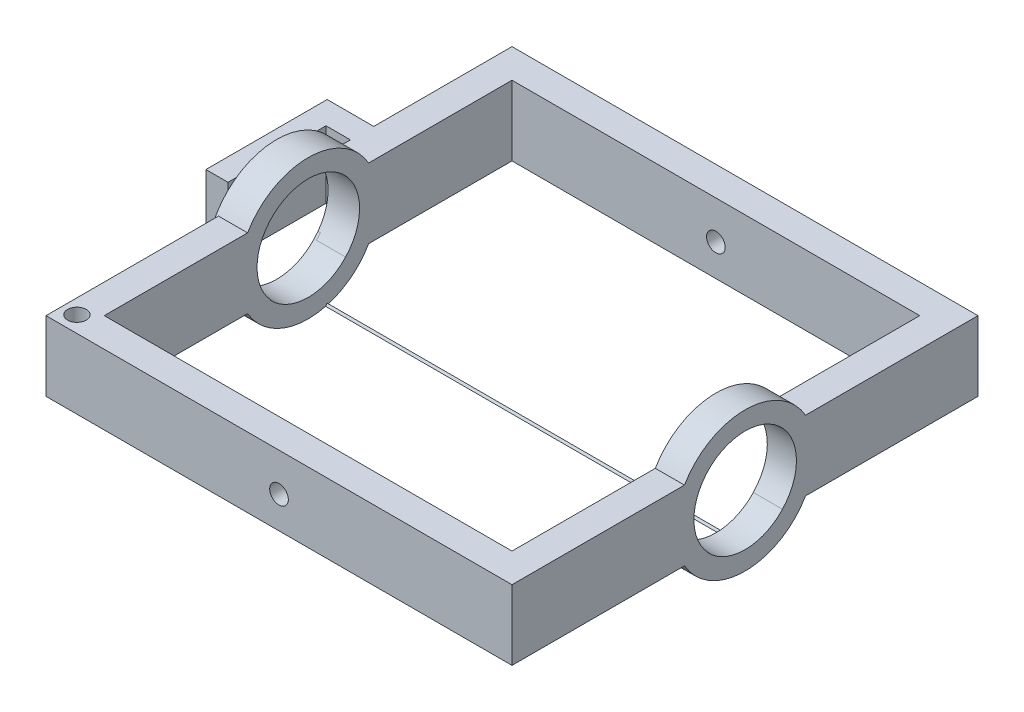
ISO-10303-21;
HEADER;
FILE_DESCRIPTION(('STEP AP214'),'2;1');
FILE_NAME('part.step','',(''),(''),'','','');
FILE_SCHEMA(('AUTOMOTIVE_DESIGN { 1 0 10303 214 1 1 1 1 }'));
ENDSEC;
DATA;
#1=APPLICATION_CONTEXT('core data for automotive mechanical design processes');
#2=APPLICATION_PROTOCOL_DEFINITION('international standard','automotive_design',2000,#1);
#3=PRODUCT_CONTEXT('',#1,'mechanical');
#4=PRODUCT('Part','Part','',(#3));
#5=PRODUCT_RELATED_PRODUCT_CATEGORY('part','',(#4));
#6=PRODUCT_DEFINITION_FORMATION('','',#4);
#7=PRODUCT_DEFINITION_CONTEXT('part definition',#1,'design');
#8=PRODUCT_DEFINITION('design','',#6,#7);
#9=PRODUCT_DEFINITION_SHAPE('','',#8);
#10=(LENGTH_UNIT() NAMED_UNIT(*) SI_UNIT(.MILLI.,.METRE.));
#11=(NAMED_UNIT(*) PLANE_ANGLE_UNIT() SI_UNIT($,.RADIAN.));
#12=(NAMED_UNIT(*) SI_UNIT($,.STERADIAN.) SOLID_ANGLE_UNIT());
#13=UNCERTAINTY_MEASURE_WITH_UNIT(LENGTH_MEASURE(1.E-05),#10,'distance_accuracy_value','');
#14=(GEOMETRIC_REPRESENTATION_CONTEXT(3) GLOBAL_UNCERTAINTY_ASSIGNED_CONTEXT((#13)) GLOBAL_UNIT_ASSIGNED_CONTEXT((#10,
#11,#12)) REPRESENTATION_CONTEXT('',''));
#15=CARTESIAN_POINT('',(0.,0.,0.));
#16=DIRECTION('',(0.,0.,1.));
#17=DIRECTION('',(1.,0.,0.));
#18=AXIS2_PLACEMENT_3D('',#15,#16,#17);
#19=CARTESIAN_POINT('',(-101.,15.,0.));
#20=DIRECTION('',(1.,0.,0.));
#21=DIRECTION('',(0.,0.,-1.));
#22=AXIS2_PLACEMENT_3D('',#19,#20,#21);
#23=CYLINDRICAL_SURFACE('',#22,30.);
#24=DIRECTION('',(1.,0.,0.));
#25=VECTOR('',#24,1.);
#26=CARTESIAN_POINT('',(-101.,30.,-25.9807621135332));
#27=LINE('',#26,#25);
#28=CARTESIAN_POINT('',(100.,30.,-25.9807621135332));
#29=VERTEX_POINT('',#28);
#30=CARTESIAN_POINT('',(87.5000000000002,30.,-25.9807621135332));
#31=VERTEX_POINT('',#30);
#32=EDGE_CURVE('E417',#29,#31,#27,.F.);
#33=ORIENTED_EDGE('',*,*,#32,.T.);
#34=CARTESIAN_POINT('',(87.5000000000002,15.,0.));
#35=DIRECTION('',(1.,0.,0.));
#36=DIRECTION('',(0.,0.,-1.));
#37=AXIS2_PLACEMENT_3D('',#34,#35,#36);
#38=CIRCLE('',#37,30.);
#39=CARTESIAN_POINT('',(87.5000000000002,30.,25.9807621135332));
#40=VERTEX_POINT('',#39);
#41=EDGE_CURVE('E295',#40,#31,#38,.F.);
#42=ORIENTED_EDGE('',*,*,#41,.F.);
#43=DIRECTION('',(1.,0.,0.));
#44=VECTOR('',#43,1.);
#45=CARTESIAN_POINT('',(-101.,30.,25.9807621135332));
#46=LINE('',#45,#44);
#47=CARTESIAN_POINT('',(100.,30.,25.9807621135331));
#48=VERTEX_POINT('',#47);
#49=EDGE_CURVE('E406',#40,#48,#46,.T.);
#50=ORIENTED_EDGE('',*,*,#49,.T.);
#51=CARTESIAN_POINT('',(100.,15.,0.));
#52=DIRECTION('',(1.,0.,0.));
#53=DIRECTION('',(0.,0.,-1.));
#54=AXIS2_PLACEMENT_3D('',#51,#52,#53);
#55=CIRCLE('',#54,30.);
#56=EDGE_CURVE('E382',#29,#48,#55,.T.);
#57=ORIENTED_EDGE('',*,*,#56,.F.);
#58=EDGE_LOOP('',(#33,#42,#50,#57));
#59=FACE_BOUND('',#58,.T.);
#60=ADVANCED_FACE('F35',(#59),#23,.T.);
#61=CARTESIAN_POINT('',(-101.,15.,0.));
#62=DIRECTION('',(1.,0.,0.));
#63=DIRECTION('',(0.,0.,-1.));
#64=AXIS2_PLACEMENT_3D('',#61,#62,#63);
#65=CYLINDRICAL_SURFACE('',#64,22.);
#66=CARTESIAN_POINT('',(-87.5,15.,0.));
#67=DIRECTION('',(1.,0.,0.));
#68=DIRECTION('',(0.,0.,-1.));
#69=AXIS2_PLACEMENT_3D('',#66,#67,#68);
#70=CIRCLE('',#69,22.);
#71=CARTESIAN_POINT('',(-87.5,0.,-16.0934769394311));
#72=VERTEX_POINT('',#71);
#73=CARTESIAN_POINT('',(-87.5,0.,16.0934769394311));
#74=VERTEX_POINT('',#73);
#75=EDGE_CURVE('E285',#72,#74,#70,.F.);
#76=ORIENTED_EDGE('',*,*,#75,.F.);
#77=DIRECTION('',(1.,0.,0.));
#78=VECTOR('',#77,1.);
#79=CARTESIAN_POINT('',(-101.,0.,-16.0934769394311));
#80=LINE('',#79,#78);
#81=CARTESIAN_POINT('',(-100.,0.,-16.0934769394311));
#82=VERTEX_POINT('',#81);
#83=EDGE_CURVE('E391',#72,#82,#80,.F.);
#84=ORIENTED_EDGE('',*,*,#83,.T.);
#85=CARTESIAN_POINT('',(-100.,15.,0.));
#86=DIRECTION('',(1.,0.,0.));
#87=DIRECTION('',(0.,0.,-1.));
#88=AXIS2_PLACEMENT_3D('',#85,#86,#87);
#89=CIRCLE('',#88,22.);
#90=CARTESIAN_POINT('',(-100.,1.98598373428147,-17.7379643881595));
#91=VERTEX_POINT('',#90);
#92=EDGE_CURVE('E394',#82,#91,#89,.T.);
#93=ORIENTED_EDGE('',*,*,#92,.T.);
#94=DIRECTION('',(1.,0.,0.));
#95=VECTOR('',#94,1.);
#96=CARTESIAN_POINT('',(-0.500000000000028,1.98598373428147,-17.7379643881595));
#97=LINE('',#96,#95);
#98=CARTESIAN_POINT('',(-101.,1.98598373428147,-17.7379643881595));
#99=VERTEX_POINT('',#98);
#100=EDGE_CURVE('E353',#91,#99,#97,.F.);
#101=ORIENTED_EDGE('',*,*,#100,.T.);
#102=CARTESIAN_POINT('',(-101.,15.,0.));
#103=DIRECTION('',(1.,0.,0.));
#104=DIRECTION('',(0.,0.,-1.));
#105=AXIS2_PLACEMENT_3D('',#102,#103,#104);
#106=CIRCLE('',#105,22.);
#107=CARTESIAN_POINT('',(-101.,28.1147890774808,17.6635870494413));
#108=VERTEX_POINT('',#107);
#109=EDGE_CURVE('E372',#108,#99,#106,.T.);
#110=ORIENTED_EDGE('',*,*,#109,.F.);
#111=DIRECTION('',(1.,0.,0.));
#112=VECTOR('',#111,1.);
#113=CARTESIAN_POINT('',(-0.500000000000028,28.1147890774808,17.6635870494413));
#114=LINE('',#113,#112);
#115=CARTESIAN_POINT('',(-100.,28.1147890774808,17.6635870494413));
#116=VERTEX_POINT('',#115);
#117=EDGE_CURVE('E363',#108,#116,#114,.T.);
#118=ORIENTED_EDGE('',*,*,#117,.T.);
#119=CARTESIAN_POINT('',(-100.,15.,0.));
#120=DIRECTION('',(1.,0.,0.));
#121=DIRECTION('',(0.,0.,-1.));
#122=AXIS2_PLACEMENT_3D('',#119,#120,#121);
#123=CIRCLE('',#122,22.);
#124=CARTESIAN_POINT('',(-100.,0.,16.0934769394311));
#125=VERTEX_POINT('',#124);
#126=EDGE_CURVE('E387',#116,#125,#123,.T.);
#127=ORIENTED_EDGE('',*,*,#126,.T.);
#128=DIRECTION('',(1.,0.,0.));
#129=VECTOR('',#128,1.);
#130=CARTESIAN_POINT('',(-101.,0.,16.0934769394311));
#131=LINE('',#130,#129);
#132=EDGE_CURVE('E381',#125,#74,#131,.T.);
#133=ORIENTED_EDGE('',*,*,#132,.T.);
#134=EDGE_LOOP('',(#76,#84,#93,#101,#110,#118,#127,#133));
#135=FACE_BOUND('',#134,.T.);
#136=ADVANCED_FACE('F649',(#135),#65,.F.);
#137=CARTESIAN_POINT('',(-101.,15.1007728117623,-0.0743773387182023));
#138=DIRECTION('',(1.,0.,0.));
#139=DIRECTION('',(0.,0.,-1.));
#140=AXIS2_PLACEMENT_3D('',#137,#138,#139);
#141=CYLINDRICAL_SURFACE('',#140,22.);
#142=DIRECTION('',(1.,0.,0.));
#143=VECTOR('',#142,1.);
#144=CARTESIAN_POINT('',(-101.,0.,-16.0733354450306));
#145=LINE('',#144,#143);
#146=CARTESIAN_POINT('',(-87.5,0.,-16.0733354450306));
#147=VERTEX_POINT('',#146);
#148=CARTESIAN_POINT('',(-100.,0.,-16.0733354450306));
#149=VERTEX_POINT('',#148);
#150=EDGE_CURVE('E348',#147,#149,#145,.F.);
#151=ORIENTED_EDGE('',*,*,#150,.F.);
#152=CARTESIAN_POINT('',(-87.5,15.1007728117623,-0.0743773387182023));
#153=DIRECTION('',(-1.,0.,0.));
#154=DIRECTION('',(0.,0.,1.));
#155=AXIS2_PLACEMENT_3D('',#152,#153,#154);
#156=CIRCLE('',#155,22.);
#157=CARTESIAN_POINT('',(-87.5,0.,15.9245807675942));
#158=VERTEX_POINT('',#157);
#159=EDGE_CURVE('E352',#158,#147,#156,.T.);
#160=ORIENTED_EDGE('',*,*,#159,.F.);
#161=DIRECTION('',(1.,0.,0.));
#162=VECTOR('',#161,1.);
#163=CARTESIAN_POINT('',(-101.,0.,15.9245807675942));
#164=LINE('',#163,#162);
#165=CARTESIAN_POINT('',(-100.,0.,15.9245807675942));
#166=VERTEX_POINT('',#165);
#167=EDGE_CURVE('E358',#166,#158,#164,.T.);
#168=ORIENTED_EDGE('',*,*,#167,.F.);
#169=CARTESIAN_POINT('',(-100.,15.1007728117623,-0.0743773387182023));
#170=DIRECTION('',(1.,0.,0.));
#171=DIRECTION('',(0.,0.,-1.));
#172=AXIS2_PLACEMENT_3D('',#169,#170,#171);
#173=CIRCLE('',#172,22.);
#174=EDGE_CURVE('E367',#116,#166,#173,.T.);
#175=ORIENTED_EDGE('',*,*,#174,.F.);
#176=ORIENTED_EDGE('',*,*,#117,.F.);
#177=CARTESIAN_POINT('',(-101.,15.1007728117623,-0.0743773387182023));
#178=DIRECTION('',(1.,0.,0.));
#179=DIRECTION('',(0.,0.,-1.));
#180=AXIS2_PLACEMENT_3D('',#177,#178,#179);
#181=CIRCLE('',#180,22.);
#182=EDGE_CURVE('E345',#99,#108,#181,.T.);
#183=ORIENTED_EDGE('',*,*,#182,.F.);
#184=ORIENTED_EDGE('',*,*,#100,.F.);
#185=CARTESIAN_POINT('',(-100.,15.1007728117623,-0.0743773387182023));
#186=DIRECTION('',(1.,0.,0.));
#187=DIRECTION('',(0.,0.,-1.));
#188=AXIS2_PLACEMENT_3D('',#185,#186,#187);
#189=CIRCLE('',#188,22.);
#190=EDGE_CURVE('E356',#149,#91,#189,.T.);
#191=ORIENTED_EDGE('',*,*,#190,.F.);
#192=EDGE_LOOP('',(#151,#160,#168,#175,#176,#183,#184,#191));
#193=FACE_BOUND('',#192,.T.);
#194=ADVANCED_FACE('F658',(#193),#141,.F.);
#195=CARTESIAN_POINT('',(87.5000000000002,15.3761332783802,31.9163524114279));
#196=DIRECTION('',(-1.,0.,0.));
#197=DIRECTION('',(0.,0.,1.));
#198=AXIS2_PLACEMENT_3D('',#195,#196,#197);
#199=CYLINDRICAL_SURFACE('',#198,49.1927831016251);
#200=CARTESIAN_POINT('',(87.5000000000002,15.3761332783802,31.9163524114279));
#201=DIRECTION('',(1.,0.,0.));
#202=DIRECTION('',(0.,0.,-1.));
#203=AXIS2_PLACEMENT_3D('',#200,#201,#202);
#204=CIRCLE('',#203,49.1927831016251);
#205=CARTESIAN_POINT('',(87.5000000000002,-14.0451900440909,-7.50845758479339));
#206=VERTEX_POINT('',#205);
#207=CARTESIAN_POINT('',(87.5000000000002,-13.164393734876,-8.15069423652366));
#208=VERTEX_POINT('',#207);
#209=EDGE_CURVE('E279',#206,#208,#204,.T.);
#210=ORIENTED_EDGE('',*,*,#209,.T.);
#211=DIRECTION('',(-1.,0.,0.));
#212=VECTOR('',#211,1.);
#213=CARTESIAN_POINT('',(0.,-13.164393734876,-8.15069423652365));
#214=LINE('',#213,#212);
#215=CARTESIAN_POINT('',(-87.5,-13.164393734876,-8.15069423652366));
#216=VERTEX_POINT('',#215);
#217=EDGE_CURVE('E11',#208,#216,#214,.T.);
#218=ORIENTED_EDGE('',*,*,#217,.T.);
#219=CARTESIAN_POINT('',(-87.5,15.3761332783802,31.9163524114279));
#220=DIRECTION('',(1.,0.,0.));
#221=DIRECTION('',(0.,0.,-1.));
#222=AXIS2_PLACEMENT_3D('',#219,#220,#221);
#223=CIRCLE('',#222,49.1927831016251);
#224=CARTESIAN_POINT('',(-87.5,-14.0451900440909,-7.50845758479339));
#225=VERTEX_POINT('',#224);
#226=EDGE_CURVE('E276',#225,#216,#223,.T.);
#227=ORIENTED_EDGE('',*,*,#226,.F.);
#228=DIRECTION('',(-1.,0.,0.));
#229=VECTOR('',#228,1.);
#230=CARTESIAN_POINT('',(0.,-14.0451900440909,-7.50845758479339));
#231=LINE('',#230,#229);
#232=EDGE_CURVE('E299',#206,#225,#231,.T.);
#233=ORIENTED_EDGE('',*,*,#232,.F.);
#234=EDGE_LOOP('',(#210,#218,#227,#233));
#235=FACE_BOUND('',#234,.T.);
#236=ADVANCED_FACE('F275',(#235),#199,.F.);
#237=CARTESIAN_POINT('',(-100.,30.,-100.));
#238=DIRECTION('',(1.,0.,0.));
#239=DIRECTION('',(0.,0.,-1.));
#240=AXIS2_PLACEMENT_3D('',#237,#238,#239);
#241=PLANE('',#240);
#242=DIRECTION('',(0.,-1.,0.));
#243=VECTOR('',#242,1.);
#244=CARTESIAN_POINT('',(-100.,30.,-40.6668274564764));
#245=LINE('',#244,#243);
#246=CARTESIAN_POINT('',(-100.,30.,-40.6668274564764));
#247=VERTEX_POINT('',#246);
#248=CARTESIAN_POINT('',(-100.,1.14409561425077,-40.6668274564764));
#249=VERTEX_POINT('',#248);
#250=EDGE_CURVE('E342',#247,#249,#245,.T.);
#251=ORIENTED_EDGE('',*,*,#250,.F.);
#252=DIRECTION('',(0.,0.,1.));
#253=VECTOR('',#252,1.);
#254=CARTESIAN_POINT('',(-100.,30.,-100.));
#255=LINE('',#254,#253);
#256=CARTESIAN_POINT('',(-100.,30.,-100.));
#257=VERTEX_POINT('',#256);
#258=EDGE_CURVE('E478',#257,#247,#255,.T.);
#259=ORIENTED_EDGE('',*,*,#258,.F.);
#260=DIRECTION('',(0.,-1.,0.));
#261=VECTOR('',#260,1.);
#262=CARTESIAN_POINT('',(-100.,30.,-100.));
#263=LINE('',#262,#261);
#264=CARTESIAN_POINT('',(-100.,0.,-100.));
#265=VERTEX_POINT('',#264);
#266=EDGE_CURVE('E504',#257,#265,#263,.T.);
#267=ORIENTED_EDGE('',*,*,#266,.T.);
#268=DIRECTION('',(0.,0.,1.));
#269=VECTOR('',#268,1.);
#270=CARTESIAN_POINT('',(-100.,0.,-100.));
#271=LINE('',#270,#269);
#272=CARTESIAN_POINT('',(-100.,0.,-25.9807621135332));
#273=VERTEX_POINT('',#272);
#274=EDGE_CURVE('E492',#265,#273,#271,.T.);
#275=ORIENTED_EDGE('',*,*,#274,.T.);
#276=CARTESIAN_POINT('',(-100.,15.,0.));
#277=DIRECTION('',(1.,0.,0.));
#278=DIRECTION('',(0.,0.,-1.));
#279=AXIS2_PLACEMENT_3D('',#276,#277,#278);
#280=CIRCLE('',#279,30.);
#281=CARTESIAN_POINT('',(-100.,30.,-25.9807621135332));
#282=VERTEX_POINT('',#281);
#283=EDGE_CURVE('E416',#273,#282,#280,.T.);
#284=ORIENTED_EDGE('',*,*,#283,.T.);
#285=CARTESIAN_POINT('',(-100.,30.,-30.6579049439222));
#286=VERTEX_POINT('',#285);
#287=EDGE_CURVE('E56',#286,#282,#255,.T.);
#288=ORIENTED_EDGE('',*,*,#287,.F.);
#289=DIRECTION('',(0.,1.,0.));
#290=VECTOR('',#289,1.);
#291=CARTESIAN_POINT('',(-100.,30.,-30.6579049439222));
#292=LINE('',#291,#290);
#293=CARTESIAN_POINT('',(-100.,1.14409561425077,-30.6579049439222));
#294=VERTEX_POINT('',#293);
#295=EDGE_CURVE('E340',#294,#286,#292,.T.);
#296=ORIENTED_EDGE('',*,*,#295,.F.);
#297=DIRECTION('',(0.,0.,1.));
#298=VECTOR('',#297,1.);
#299=CARTESIAN_POINT('',(-100.,1.14409561425077,-100.));
#300=LINE('',#299,#298);
#301=EDGE_CURVE('E50',#249,#294,#300,.T.);
#302=ORIENTED_EDGE('',*,*,#301,.F.);
#303=EDGE_LOOP('',(#251,#259,#267,#275,#284,#288,#296,#302));
#304=FACE_BOUND('',#303,.T.);
#305=ADVANCED_FACE('F543',(#304),#241,.F.);
#306=CARTESIAN_POINT('',(0.,13.6147395955971,-150.5));
#307=DIRECTION('',(0.,0.,1.));
#308=DIRECTION('',(1.,0.,0.));
#309=AXIS2_PLACEMENT_3D('',#306,#307,#308);
#310=CYLINDRICAL_SURFACE('',#309,4.);
#311=CARTESIAN_POINT('',(0.,13.6147395955971,100.));
#312=DIRECTION('',(0.,0.,1.));
#313=DIRECTION('',(1.,0.,0.));
#314=AXIS2_PLACEMENT_3D('',#311,#312,#313);
#315=CIRCLE('',#314,4.);
#316=CARTESIAN_POINT('',(4.,13.6147395955971,100.));
#317=VERTEX_POINT('',#316);
#318=EDGE_CURVE('E419',#317,#317,#315,.T.);
#319=ORIENTED_EDGE('',*,*,#318,.T.);
#320=EDGE_LOOP('',(#319));
#321=FACE_BOUND('',#320,.T.);
#322=CARTESIAN_POINT('',(0.,13.6147395955971,87.5));
#323=DIRECTION('',(0.,0.,1.));
#324=DIRECTION('',(1.,0.,0.));
#325=AXIS2_PLACEMENT_3D('',#322,#323,#324);
#326=CIRCLE('',#325,4.);
#327=CARTESIAN_POINT('',(4.,13.6147395955971,87.5));
#328=VERTEX_POINT('',#327);
#329=EDGE_CURVE('E423',#328,#328,#326,.T.);
#330=ORIENTED_EDGE('',*,*,#329,.F.);
#331=EDGE_LOOP('',(#330));
#332=FACE_BOUND('',#331,.T.);
#333=ADVANCED_FACE('F738',(#321,#332),#310,.F.);
#334=CARTESIAN_POINT('',(0.,13.6147395955971,-87.5));
#335=DIRECTION('',(0.,0.,-1.));
#336=DIRECTION('',(-1.,0.,0.));
#337=AXIS2_PLACEMENT_3D('',#334,#335,#336);
#338=CIRCLE('',#337,4.);
#339=CARTESIAN_POINT('',(-4.,13.6147395955971,-87.5));
#340=VERTEX_POINT('',#339);
#341=EDGE_CURVE('E422',#340,#340,#338,.T.);
#342=ORIENTED_EDGE('',*,*,#341,.F.);
#343=EDGE_LOOP('',(#342));
#344=FACE_BOUND('',#343,.T.);
#345=CARTESIAN_POINT('',(0.,13.6147395955971,-100.));
#346=DIRECTION('',(0.,0.,1.));
#347=DIRECTION('',(1.,0.,0.));
#348=AXIS2_PLACEMENT_3D('',#345,#346,#347);
#349=CIRCLE('',#348,4.);
#350=CARTESIAN_POINT('',(4.,13.6147395955971,-100.));
#351=VERTEX_POINT('',#350);
#352=EDGE_CURVE('E426',#351,#351,#349,.T.);
#353=ORIENTED_EDGE('',*,*,#352,.F.);
#354=EDGE_LOOP('',(#353));
#355=FACE_BOUND('',#354,.T.);
#356=ADVANCED_FACE('F936',(#344,#355),#310,.F.);
#357=CARTESIAN_POINT('',(-87.5,0.,-87.5));
#358=DIRECTION('',(0.,0.,-1.));
#359=DIRECTION('',(-1.,0.,0.));
#360=AXIS2_PLACEMENT_3D('',#357,#358,#359);
#361=PLANE('',#360);
#362=ORIENTED_EDGE('',*,*,#341,.T.);
#363=EDGE_LOOP('',(#362));
#364=FACE_BOUND('',#363,.T.);
#365=DIRECTION('',(-1.,0.,0.));
#366=VECTOR('',#365,1.);
#367=CARTESIAN_POINT('',(-87.5,30.,-87.5));
#368=LINE('',#367,#366);
#369=CARTESIAN_POINT('',(87.5,30.,-87.5));
#370=VERTEX_POINT('',#369);
#371=CARTESIAN_POINT('',(-87.5,30.,-87.5));
#372=VERTEX_POINT('',#371);
#373=EDGE_CURVE('E451',#370,#372,#368,.T.);
#374=ORIENTED_EDGE('',*,*,#373,.T.);
#375=DIRECTION('',(0.,1.,0.));
#376=VECTOR('',#375,1.);
#377=CARTESIAN_POINT('',(-87.5,0.,-87.5));
#378=LINE('',#377,#376);
#379=CARTESIAN_POINT('',(-87.5,0.,-87.5));
#380=VERTEX_POINT('',#379);
#381=EDGE_CURVE('E468',#380,#372,#378,.T.);
#382=ORIENTED_EDGE('',*,*,#381,.F.);
#383=DIRECTION('',(-1.,0.,0.));
#384=VECTOR('',#383,1.);
#385=CARTESIAN_POINT('',(-87.5,0.,-87.5));
#386=LINE('',#385,#384);
#387=CARTESIAN_POINT('',(87.5,0.,-87.5));
#388=VERTEX_POINT('',#387);
#389=EDGE_CURVE('E435',#388,#380,#386,.T.);
#390=ORIENTED_EDGE('',*,*,#389,.F.);
#391=DIRECTION('',(0.,1.,0.));
#392=VECTOR('',#391,1.);
#393=CARTESIAN_POINT('',(87.5,0.,-87.5));
#394=LINE('',#393,#392);
#395=EDGE_CURVE('E448',#388,#370,#394,.T.);
#396=ORIENTED_EDGE('',*,*,#395,.T.);
#397=EDGE_LOOP('',(#374,#382,#390,#396));
#398=FACE_BOUND('',#397,.T.);
#399=ADVANCED_FACE('F638',(#364,#398),#361,.F.);
#400=CARTESIAN_POINT('',(87.5,0.,87.5));
#401=DIRECTION('',(1.,0.,0.));
#402=DIRECTION('',(0.,0.,-1.));
#403=AXIS2_PLACEMENT_3D('',#400,#401,#402);
#404=PLANE('',#403);
#405=ORIENTED_EDGE('',*,*,#395,.F.);
#406=DIRECTION('',(0.,0.,-1.));
#407=VECTOR('',#406,1.);
#408=CARTESIAN_POINT('',(87.5,0.,87.5));
#409=LINE('',#408,#407);
#410=CARTESIAN_POINT('',(87.5000000000002,0.,-25.9807621135332));
#411=VERTEX_POINT('',#410);
#412=EDGE_CURVE('E461',#411,#388,#409,.T.);
#413=ORIENTED_EDGE('',*,*,#412,.F.);
#414=CARTESIAN_POINT('',(87.5000000000002,15.,0.));
#415=DIRECTION('',(1.,0.,0.));
#416=DIRECTION('',(0.,0.,-1.));
#417=AXIS2_PLACEMENT_3D('',#414,#415,#416);
#418=CIRCLE('',#417,30.);
#419=CARTESIAN_POINT('',(87.5000000000002,-13.7132471437681,-8.6919179966734));
#420=VERTEX_POINT('',#419);
#421=EDGE_CURVE('E287',#411,#420,#418,.F.);
#422=ORIENTED_EDGE('',*,*,#421,.T.);
#423=CARTESIAN_POINT('',(87.5000000000002,15.4944351837685,-37.7624347741516));
#424=DIRECTION('',(1.,0.,0.));
#425=DIRECTION('',(0.,0.,-1.));
#426=AXIS2_PLACEMENT_3D('',#423,#424,#425);
#427=CIRCLE('',#426,41.2090239226305);
#428=EDGE_CURVE('E270',#208,#420,#427,.T.);
#429=ORIENTED_EDGE('',*,*,#428,.F.);
#430=ORIENTED_EDGE('',*,*,#209,.F.);
#431=CARTESIAN_POINT('',(87.5000000000002,0.,25.9807621135331));
#432=VERTEX_POINT('',#431);
#433=EDGE_CURVE('E296',#206,#432,#38,.F.);
#434=ORIENTED_EDGE('',*,*,#433,.T.);
#435=CARTESIAN_POINT('',(87.5,0.,87.5));
#436=VERTEX_POINT('',#435);
#437=EDGE_CURVE('E433',#436,#432,#409,.T.);
#438=ORIENTED_EDGE('',*,*,#437,.F.);
#439=DIRECTION('',(0.,1.,0.));
#440=VECTOR('',#439,1.);
#441=CARTESIAN_POINT('',(87.5,0.,87.5));
#442=LINE('',#441,#440);
#443=CARTESIAN_POINT('',(87.5,30.,87.5));
#444=VERTEX_POINT('',#443);
#445=EDGE_CURVE('E462',#436,#444,#442,.T.);
#446=ORIENTED_EDGE('',*,*,#445,.T.);
#447=DIRECTION('',(0.,0.,-1.));
#448=VECTOR('',#447,1.);
#449=CARTESIAN_POINT('',(87.5,30.,87.5));
#450=LINE('',#449,#448);
#451=EDGE_CURVE('E449',#444,#40,#450,.T.);
#452=ORIENTED_EDGE('',*,*,#451,.T.);
#453=ORIENTED_EDGE('',*,*,#41,.T.);
#454=EDGE_CURVE('E452',#31,#370,#450,.T.);
#455=ORIENTED_EDGE('',*,*,#454,.T.);
#456=EDGE_LOOP('',(#405,#413,#422,#429,#430,#434,#438,#446,#452,#453,#455));
#457=FACE_BOUND('',#456,.T.);
#458=CARTESIAN_POINT('',(87.5000000000002,0.,16.0934769394311));
#459=VERTEX_POINT('',#458);
#460=CARTESIAN_POINT('',(87.5,0.,15.9245807675942));
#461=VERTEX_POINT('',#460);
#462=EDGE_CURVE('E436',#459,#461,#409,.T.);
#463=ORIENTED_EDGE('',*,*,#462,.F.);
#464=CARTESIAN_POINT('',(87.5000000000002,15.,0.));
#465=DIRECTION('',(1.,0.,0.));
#466=DIRECTION('',(0.,0.,-1.));
#467=AXIS2_PLACEMENT_3D('',#464,#465,#466);
#468=CIRCLE('',#467,22.);
#469=CARTESIAN_POINT('',(87.5000000000002,0.,-16.0934769394311));
#470=VERTEX_POINT('',#469);
#471=EDGE_CURVE('E293',#470,#459,#468,.F.);
#472=ORIENTED_EDGE('',*,*,#471,.F.);
#473=CARTESIAN_POINT('',(87.5,0.,-16.0733354450306));
#474=VERTEX_POINT('',#473);
#475=EDGE_CURVE('E437',#474,#470,#409,.T.);
#476=ORIENTED_EDGE('',*,*,#475,.F.);
#477=CARTESIAN_POINT('',(87.5,15.1007728117623,-0.0743773387182023));
#478=DIRECTION('',(1.,0.,0.));
#479=DIRECTION('',(0.,0.,-1.));
#480=AXIS2_PLACEMENT_3D('',#477,#478,#479);
#481=CIRCLE('',#480,22.);
#482=EDGE_CURVE('E350',#474,#461,#481,.T.);
#483=ORIENTED_EDGE('',*,*,#482,.T.);
#484=EDGE_LOOP('',(#463,#472,#476,#483));
#485=FACE_BOUND('',#484,.T.);
#486=ADVANCED_FACE('F602',(#457,#485),#404,.F.);
#487=CARTESIAN_POINT('',(-87.5,0.,87.5));
#488=DIRECTION('',(0.,0.,1.));
#489=DIRECTION('',(1.,0.,0.));
#490=AXIS2_PLACEMENT_3D('',#487,#488,#489);
#491=PLANE('',#490);
#492=ORIENTED_EDGE('',*,*,#329,.T.);
#493=EDGE_LOOP('',(#492));
#494=FACE_BOUND('',#493,.T.);
#495=DIRECTION('',(1.,0.,0.));
#496=VECTOR('',#495,1.);
#497=CARTESIAN_POINT('',(-87.5,30.,87.5));
#498=LINE('',#497,#496);
#499=CARTESIAN_POINT('',(-87.5,30.,87.5));
#500=VERTEX_POINT('',#499);
#501=EDGE_CURVE('E458',#500,#444,#498,.T.);
#502=ORIENTED_EDGE('',*,*,#501,.T.);
#503=ORIENTED_EDGE('',*,*,#445,.F.);
#504=DIRECTION('',(1.,0.,0.));
#505=VECTOR('',#504,1.);
#506=CARTESIAN_POINT('',(-87.5,0.,87.5));
#507=LINE('',#506,#505);
#508=CARTESIAN_POINT('',(-87.5,0.,87.5));
#509=VERTEX_POINT('',#508);
#510=EDGE_CURVE('E443',#509,#436,#507,.T.);
#511=ORIENTED_EDGE('',*,*,#510,.F.);
#512=DIRECTION('',(0.,1.,0.));
#513=VECTOR('',#512,1.);
#514=CARTESIAN_POINT('',(-87.5,0.,87.5));
#515=LINE('',#514,#513);
#516=EDGE_CURVE('E465',#509,#500,#515,.T.);
#517=ORIENTED_EDGE('',*,*,#516,.T.);
#518=EDGE_LOOP('',(#502,#503,#511,#517));
#519=FACE_BOUND('',#518,.T.);
#520=ADVANCED_FACE('F633',(#494,#519),#491,.F.);
#521=CARTESIAN_POINT('',(-87.5,0.,87.5));
#522=DIRECTION('',(-1.,0.,0.));
#523=DIRECTION('',(0.,0.,1.));
#524=AXIS2_PLACEMENT_3D('',#521,#522,#523);
#525=PLANE('',#524);
#526=ORIENTED_EDGE('',*,*,#226,.T.);
#527=CARTESIAN_POINT('',(-87.5,15.4944351837685,-37.7624347741516));
#528=DIRECTION('',(1.,0.,0.));
#529=DIRECTION('',(0.,0.,-1.));
#530=AXIS2_PLACEMENT_3D('',#527,#528,#529);
#531=CIRCLE('',#530,41.2090239226305);
#532=CARTESIAN_POINT('',(-87.5,-13.7132471437681,-8.6919179966734));
#533=VERTEX_POINT('',#532);
#534=EDGE_CURVE('E260',#216,#533,#531,.T.);
#535=ORIENTED_EDGE('',*,*,#534,.T.);
#536=CARTESIAN_POINT('',(-87.5,15.,0.));
#537=DIRECTION('',(1.,0.,0.));
#538=DIRECTION('',(0.,0.,-1.));
#539=AXIS2_PLACEMENT_3D('',#536,#537,#538);
#540=CIRCLE('',#539,30.);
#541=CARTESIAN_POINT('',(-87.5,0.,-25.9807621135332));
#542=VERTEX_POINT('',#541);
#543=EDGE_CURVE('E562',#542,#533,#540,.F.);
#544=ORIENTED_EDGE('',*,*,#543,.F.);
#545=DIRECTION('',(0.,0.,1.));
#546=VECTOR('',#545,1.);
#547=CARTESIAN_POINT('',(-87.5,0.,87.5));
#548=LINE('',#547,#546);
#549=EDGE_CURVE('E441',#380,#542,#548,.T.);
#550=ORIENTED_EDGE('',*,*,#549,.F.);
#551=ORIENTED_EDGE('',*,*,#381,.T.);
#552=DIRECTION('',(0.,0.,1.));
#553=VECTOR('',#552,1.);
#554=CARTESIAN_POINT('',(-87.5,30.,87.5));
#555=LINE('',#554,#553);
#556=CARTESIAN_POINT('',(-87.5,30.,-25.9807621135332));
#557=VERTEX_POINT('',#556);
#558=EDGE_CURVE('E456',#372,#557,#555,.T.);
#559=ORIENTED_EDGE('',*,*,#558,.T.);
#560=CARTESIAN_POINT('',(-87.5,15.,0.));
#561=DIRECTION('',(1.,0.,0.));
#562=DIRECTION('',(0.,0.,-1.));
#563=AXIS2_PLACEMENT_3D('',#560,#561,#562);
#564=CIRCLE('',#563,30.);
#565=CARTESIAN_POINT('',(-87.5,30.,25.9807621135332));
#566=VERTEX_POINT('',#565);
#567=EDGE_CURVE('E291',#566,#557,#564,.F.);
#568=ORIENTED_EDGE('',*,*,#567,.F.);
#569=EDGE_CURVE('E455',#566,#500,#555,.T.);
#570=ORIENTED_EDGE('',*,*,#569,.T.);
#571=ORIENTED_EDGE('',*,*,#516,.F.);
#572=CARTESIAN_POINT('',(-87.5,0.,25.9807621135331));
#573=VERTEX_POINT('',#572);
#574=EDGE_CURVE('E440',#573,#509,#548,.T.);
#575=ORIENTED_EDGE('',*,*,#574,.F.);
#576=EDGE_CURVE('E283',#225,#573,#564,.F.);
#577=ORIENTED_EDGE('',*,*,#576,.F.);
#578=EDGE_LOOP('',(#526,#535,#544,#550,#551,#559,#568,#570,#571,#575,#577));
#579=FACE_BOUND('',#578,.T.);
#580=ORIENTED_EDGE('',*,*,#75,.T.);
#581=EDGE_CURVE('E445',#158,#74,#548,.T.);
#582=ORIENTED_EDGE('',*,*,#581,.F.);
#583=ORIENTED_EDGE('',*,*,#159,.T.);
#584=EDGE_CURVE('E444',#72,#147,#548,.T.);
#585=ORIENTED_EDGE('',*,*,#584,.F.);
#586=EDGE_LOOP('',(#580,#582,#583,#585));
#587=FACE_BOUND('',#586,.T.);
#588=ADVANCED_FACE('F280',(#579,#587),#525,.F.);
#589=CARTESIAN_POINT('',(-100.,30.,25.9807621135332));
#590=VERTEX_POINT('',#589);
#591=CARTESIAN_POINT('',(-100.,30.,100.));
#592=VERTEX_POINT('',#591);
#593=EDGE_CURVE('E477',#590,#592,#255,.T.);
#594=ORIENTED_EDGE('',*,*,#593,.F.);
#595=CARTESIAN_POINT('',(-100.,15.,0.));
#596=DIRECTION('',(1.,0.,0.));
#597=DIRECTION('',(0.,0.,-1.));
#598=AXIS2_PLACEMENT_3D('',#595,#596,#597);
#599=CIRCLE('',#598,30.);
#600=CARTESIAN_POINT('',(-100.,0.,25.9807621135332));
#601=VERTEX_POINT('',#600);
#602=EDGE_CURVE('E405',#590,#601,#599,.T.);
#603=ORIENTED_EDGE('',*,*,#602,.T.);
#604=CARTESIAN_POINT('',(-100.,0.,100.));
#605=VERTEX_POINT('',#604);
#606=EDGE_CURVE('E491',#601,#605,#271,.T.);
#607=ORIENTED_EDGE('',*,*,#606,.T.);
#608=DIRECTION('',(0.,-1.,0.));
#609=VECTOR('',#608,1.);
#610=CARTESIAN_POINT('',(-100.,30.,100.));
#611=LINE('',#610,#609);
#612=EDGE_CURVE('E501',#592,#605,#611,.T.);
#613=ORIENTED_EDGE('',*,*,#612,.F.);
#614=EDGE_LOOP('',(#594,#603,#607,#613));
#615=FACE_BOUND('',#614,.T.);
#616=ADVANCED_FACE('F577',(#615),#241,.F.);
#617=CARTESIAN_POINT('',(-93.6945215497768,-201.,93.0455013493783));
#618=DIRECTION('',(0.,1.,0.));
#619=DIRECTION('',(0.,0.,1.));
#620=AXIS2_PLACEMENT_3D('',#617,#618,#619);
#621=CYLINDRICAL_SURFACE('',#620,4.00000000000001);
#622=CARTESIAN_POINT('',(-93.6945215497768,30.,93.0455013493783));
#623=DIRECTION('',(0.,1.,0.));
#624=DIRECTION('',(0.,0.,1.));
#625=AXIS2_PLACEMENT_3D('',#622,#623,#624);
#626=CIRCLE('',#625,4.00000000000001);
#627=CARTESIAN_POINT('',(-93.6945215497768,30.,97.0455013493783));
#628=VERTEX_POINT('',#627);
#629=EDGE_CURVE('E429',#628,#628,#626,.T.);
#630=ORIENTED_EDGE('',*,*,#629,.T.);
#631=EDGE_LOOP('',(#630));
#632=FACE_BOUND('',#631,.T.);
#633=CARTESIAN_POINT('',(-93.6945215497768,0.,93.0455013493783));
#634=DIRECTION('',(0.,1.,0.));
#635=DIRECTION('',(0.,0.,1.));
#636=AXIS2_PLACEMENT_3D('',#633,#634,#635);
#637=CIRCLE('',#636,4.00000000000001);
#638=CARTESIAN_POINT('',(-93.6945215497768,0.,97.0455013493783));
#639=VERTEX_POINT('',#638);
#640=EDGE_CURVE('E432',#639,#639,#637,.T.);
#641=ORIENTED_EDGE('',*,*,#640,.F.);
#642=EDGE_LOOP('',(#641));
#643=FACE_BOUND('',#642,.T.);
#644=ADVANCED_FACE('F968',(#632,#643),#621,.F.);
#645=CARTESIAN_POINT('',(-100.,30.,100.));
#646=DIRECTION('',(0.,0.,-1.));
#647=DIRECTION('',(-1.,0.,0.));
#648=AXIS2_PLACEMENT_3D('',#645,#646,#647);
#649=PLANE('',#648);
#650=ORIENTED_EDGE('',*,*,#318,.F.);
#651=EDGE_LOOP('',(#650));
#652=FACE_BOUND('',#651,.T.);
#653=DIRECTION('',(1.,0.,0.));
#654=VECTOR('',#653,1.);
#655=CARTESIAN_POINT('',(-100.,0.,100.));
#656=LINE('',#655,#654);
#657=CARTESIAN_POINT('',(100.,0.,100.));
#658=VERTEX_POINT('',#657);
#659=EDGE_CURVE('E495',#605,#658,#656,.T.);
#660=ORIENTED_EDGE('',*,*,#659,.T.);
#661=DIRECTION('',(0.,-1.,0.));
#662=VECTOR('',#661,1.);
#663=CARTESIAN_POINT('',(100.,30.,100.));
#664=LINE('',#663,#662);
#665=CARTESIAN_POINT('',(100.,30.,100.));
#666=VERTEX_POINT('',#665);
#667=EDGE_CURVE('E483',#666,#658,#664,.T.);
#668=ORIENTED_EDGE('',*,*,#667,.F.);
#669=DIRECTION('',(1.,0.,0.));
#670=VECTOR('',#669,1.);
#671=CARTESIAN_POINT('',(-100.,30.,100.));
#672=LINE('',#671,#670);
#673=EDGE_CURVE('E481',#592,#666,#672,.T.);
#674=ORIENTED_EDGE('',*,*,#673,.F.);
#675=ORIENTED_EDGE('',*,*,#612,.T.);
#676=EDGE_LOOP('',(#660,#668,#674,#675));
#677=FACE_BOUND('',#676,.T.);
#678=ADVANCED_FACE('F581',(#652,#677),#649,.F.);
#679=CARTESIAN_POINT('',(0.,30.,0.));
#680=DIRECTION('',(0.,1.,0.));
#681=DIRECTION('',(0.,0.,1.));
#682=AXIS2_PLACEMENT_3D('',#679,#680,#681);
#683=PLANE('',#682);
#684=EDGE_CURVE('E401',#590,#566,#46,.T.);
#685=ORIENTED_EDGE('',*,*,#684,.F.);
#686=ORIENTED_EDGE('',*,*,#593,.T.);
#687=ORIENTED_EDGE('',*,*,#673,.T.);
#688=DIRECTION('',(0.,0.,-1.));
#689=VECTOR('',#688,1.);
#690=CARTESIAN_POINT('',(100.,30.,-100.));
#691=LINE('',#690,#689);
#692=EDGE_CURVE('E472',#666,#48,#691,.T.);
#693=ORIENTED_EDGE('',*,*,#692,.T.);
#694=ORIENTED_EDGE('',*,*,#49,.F.);
#695=ORIENTED_EDGE('',*,*,#451,.F.);
#696=ORIENTED_EDGE('',*,*,#501,.F.);
#697=ORIENTED_EDGE('',*,*,#569,.F.);
#698=EDGE_LOOP('',(#685,#686,#687,#693,#694,#695,#696,#697));
#699=FACE_BOUND('',#698,.T.);
#700=ORIENTED_EDGE('',*,*,#629,.F.);
#701=EDGE_LOOP('',(#700));
#702=FACE_BOUND('',#701,.T.);
#703=ADVANCED_FACE('F571',(#699,#702),#683,.T.);
#704=DIRECTION('',(-1.,0.,0.));
#705=VECTOR('',#704,1.);
#706=CARTESIAN_POINT('',(-120.,30.,11.3734027973912));
#707=LINE('',#706,#705);
#708=CARTESIAN_POINT('',(-110.5,30.,11.3734027973912));
#709=VERTEX_POINT('',#708);
#710=CARTESIAN_POINT('',(-120.,30.,11.3734027973912));
#711=VERTEX_POINT('',#710);
#712=EDGE_CURVE('E320',#709,#711,#707,.T.);
#713=ORIENTED_EDGE('',*,*,#712,.F.);
#714=DIRECTION('',(0.,0.,1.));
#715=VECTOR('',#714,1.);
#716=CARTESIAN_POINT('',(-110.5,30.,-40.6668274564764));
#717=LINE('',#716,#715);
#718=CARTESIAN_POINT('',(-110.5,30.,-30.6579049439222));
#719=VERTEX_POINT('',#718);
#720=EDGE_CURVE('E314',#719,#709,#717,.T.);
#721=ORIENTED_EDGE('',*,*,#720,.F.);
#722=DIRECTION('',(-1.,0.,0.));
#723=VECTOR('',#722,1.);
#724=CARTESIAN_POINT('',(-89.4999999999998,30.,-30.6579049439222));
#725=LINE('',#724,#723);
#726=EDGE_CURVE('E335',#286,#719,#725,.T.);
#727=ORIENTED_EDGE('',*,*,#726,.F.);
#728=ORIENTED_EDGE('',*,*,#287,.T.);
#729=EDGE_CURVE('E412',#557,#282,#27,.F.);
#730=ORIENTED_EDGE('',*,*,#729,.F.);
#731=ORIENTED_EDGE('',*,*,#558,.F.);
#732=ORIENTED_EDGE('',*,*,#373,.F.);
#733=ORIENTED_EDGE('',*,*,#454,.F.);
#734=ORIENTED_EDGE('',*,*,#32,.F.);
#735=CARTESIAN_POINT('',(100.,30.,-100.));
#736=VERTEX_POINT('',#735);
#737=EDGE_CURVE('E475',#29,#736,#691,.T.);
#738=ORIENTED_EDGE('',*,*,#737,.T.);
#739=DIRECTION('',(-1.,0.,0.));
#740=VECTOR('',#739,1.);
#741=CARTESIAN_POINT('',(-100.,30.,-100.));
#742=LINE('',#741,#740);
#743=EDGE_CURVE('E474',#736,#257,#742,.T.);
#744=ORIENTED_EDGE('',*,*,#743,.T.);
#745=ORIENTED_EDGE('',*,*,#258,.T.);
#746=DIRECTION('',(-1.,0.,0.));
#747=VECTOR('',#746,1.);
#748=CARTESIAN_POINT('',(-89.4999999999998,30.,-40.6668274564764));
#749=LINE('',#748,#747);
#750=CARTESIAN_POINT('',(-120.,30.,-40.6668274564764));
#751=VERTEX_POINT('',#750);
#752=EDGE_CURVE('E338',#247,#751,#749,.T.);
#753=ORIENTED_EDGE('',*,*,#752,.T.);
#754=DIRECTION('',(0.,0.,-1.));
#755=VECTOR('',#754,1.);
#756=CARTESIAN_POINT('',(-120.,30.,-14.6668274564762));
#757=LINE('',#756,#755);
#758=EDGE_CURVE('E317',#711,#751,#757,.T.);
#759=ORIENTED_EDGE('',*,*,#758,.F.);
#760=EDGE_LOOP('',(#713,#721,#727,#728,#730,#731,#732,#733,#734,#738,#744,#745,#753,#759));
#761=FACE_BOUND('',#760,.T.);
#762=ADVANCED_FACE('F539',(#761),#683,.T.);
#763=CARTESIAN_POINT('',(-100.,30.,-100.));
#764=DIRECTION('',(0.,0.,1.));
#765=DIRECTION('',(1.,0.,0.));
#766=AXIS2_PLACEMENT_3D('',#763,#764,#765);
#767=PLANE('',#766);
#768=ORIENTED_EDGE('',*,*,#352,.T.);
#769=EDGE_LOOP('',(#768));
#770=FACE_BOUND('',#769,.T.);
#771=DIRECTION('',(-1.,0.,0.));
#772=VECTOR('',#771,1.);
#773=CARTESIAN_POINT('',(-100.,0.,-100.));
#774=LINE('',#773,#772);
#775=CARTESIAN_POINT('',(100.,0.,-100.));
#776=VERTEX_POINT('',#775);
#777=EDGE_CURVE('E487',#776,#265,#774,.T.);
#778=ORIENTED_EDGE('',*,*,#777,.T.);
#779=ORIENTED_EDGE('',*,*,#266,.F.);
#780=ORIENTED_EDGE('',*,*,#743,.F.);
#781=DIRECTION('',(0.,-1.,0.));
#782=VECTOR('',#781,1.);
#783=CARTESIAN_POINT('',(100.,30.,-100.));
#784=LINE('',#783,#782);
#785=EDGE_CURVE('E507',#736,#776,#784,.T.);
#786=ORIENTED_EDGE('',*,*,#785,.T.);
#787=EDGE_LOOP('',(#778,#779,#780,#786));
#788=FACE_BOUND('',#787,.T.);
#789=ADVANCED_FACE('F553',(#770,#788),#767,.F.);
#790=CARTESIAN_POINT('',(0.,0.,0.));
#791=DIRECTION('',(0.,1.,0.));
#792=DIRECTION('',(0.,0.,1.));
#793=AXIS2_PLACEMENT_3D('',#790,#791,#792);
#794=PLANE('',#793);
#795=DIRECTION('',(0.,0.,-1.));
#796=VECTOR('',#795,1.);
#797=CARTESIAN_POINT('',(100.,0.,-100.));
#798=LINE('',#797,#796);
#799=CARTESIAN_POINT('',(100.,0.,-25.9807621135332));
#800=VERTEX_POINT('',#799);
#801=EDGE_CURVE('E464',#800,#776,#798,.T.);
#802=ORIENTED_EDGE('',*,*,#801,.F.);
#803=DIRECTION('',(1.,0.,0.));
#804=VECTOR('',#803,1.);
#805=CARTESIAN_POINT('',(-101.,0.,-25.9807621135332));
#806=LINE('',#805,#804);
#807=EDGE_CURVE('E413',#800,#411,#806,.F.);
#808=ORIENTED_EDGE('',*,*,#807,.T.);
#809=ORIENTED_EDGE('',*,*,#412,.T.);
#810=ORIENTED_EDGE('',*,*,#389,.T.);
#811=ORIENTED_EDGE('',*,*,#549,.T.);
#812=EDGE_CURVE('E409',#542,#273,#806,.F.);
#813=ORIENTED_EDGE('',*,*,#812,.T.);
#814=ORIENTED_EDGE('',*,*,#274,.F.);
#815=ORIENTED_EDGE('',*,*,#777,.F.);
#816=EDGE_LOOP('',(#802,#808,#809,#810,#811,#813,#814,#815));
#817=FACE_BOUND('',#816,.T.);
#818=ADVANCED_FACE('F557',(#817),#794,.F.);
#819=ORIENTED_EDGE('',*,*,#421,.F.);
#820=ORIENTED_EDGE('',*,*,#807,.F.);
#821=CARTESIAN_POINT('',(100.,0.,25.9807621135331));
#822=VERTEX_POINT('',#821);
#823=EDGE_CURVE('E375',#822,#800,#55,.T.);
#824=ORIENTED_EDGE('',*,*,#823,.F.);
#825=DIRECTION('',(1.,0.,0.));
#826=VECTOR('',#825,1.);
#827=CARTESIAN_POINT('',(-101.,0.,25.9807621135332));
#828=LINE('',#827,#826);
#829=EDGE_CURVE('E402',#432,#822,#828,.T.);
#830=ORIENTED_EDGE('',*,*,#829,.F.);
#831=ORIENTED_EDGE('',*,*,#433,.F.);
#832=ORIENTED_EDGE('',*,*,#232,.T.);
#833=ORIENTED_EDGE('',*,*,#576,.T.);
#834=EDGE_CURVE('E398',#601,#573,#828,.T.);
#835=ORIENTED_EDGE('',*,*,#834,.F.);
#836=ORIENTED_EDGE('',*,*,#602,.F.);
#837=ORIENTED_EDGE('',*,*,#684,.T.);
#838=ORIENTED_EDGE('',*,*,#567,.T.);
#839=ORIENTED_EDGE('',*,*,#729,.T.);
#840=ORIENTED_EDGE('',*,*,#283,.F.);
#841=ORIENTED_EDGE('',*,*,#812,.F.);
#842=ORIENTED_EDGE('',*,*,#543,.T.);
#843=DIRECTION('',(-1.,0.,0.));
#844=VECTOR('',#843,1.);
#845=CARTESIAN_POINT('',(0.,-13.7132471437681,-8.6919179966734));
#846=LINE('',#845,#844);
#847=EDGE_CURVE('E265',#533,#420,#846,.F.);
#848=ORIENTED_EDGE('',*,*,#847,.T.);
#849=EDGE_LOOP('',(#819,#820,#824,#830,#831,#832,#833,#835,#836,#837,#838,#839,#840,#841,#842,#848));
#850=FACE_BOUND('',#849,.T.);
#851=CARTESIAN_POINT('',(-101.,15.,0.));
#852=DIRECTION('',(1.,0.,0.));
#853=DIRECTION('',(0.,0.,-1.));
#854=AXIS2_PLACEMENT_3D('',#851,#852,#853);
#855=CIRCLE('',#854,30.);
#856=CARTESIAN_POINT('',(-101.,15.,-30.));
#857=VERTEX_POINT('',#856);
#858=EDGE_CURVE('E378',#857,#857,#855,.T.);
#859=ORIENTED_EDGE('',*,*,#858,.T.);
#860=EDGE_LOOP('',(#859));
#861=FACE_BOUND('',#860,.T.);
#862=ADVANCED_FACE('F560',(#850,#861),#23,.T.);
#863=ORIENTED_EDGE('',*,*,#640,.T.);
#864=EDGE_LOOP('',(#863));
#865=FACE_BOUND('',#864,.T.);
#866=ORIENTED_EDGE('',*,*,#606,.F.);
#867=ORIENTED_EDGE('',*,*,#834,.T.);
#868=ORIENTED_EDGE('',*,*,#574,.T.);
#869=ORIENTED_EDGE('',*,*,#510,.T.);
#870=ORIENTED_EDGE('',*,*,#437,.T.);
#871=ORIENTED_EDGE('',*,*,#829,.T.);
#872=EDGE_CURVE('E484',#658,#822,#798,.T.);
#873=ORIENTED_EDGE('',*,*,#872,.F.);
#874=ORIENTED_EDGE('',*,*,#659,.F.);
#875=EDGE_LOOP('',(#866,#867,#868,#869,#870,#871,#873,#874));
#876=FACE_BOUND('',#875,.T.);
#877=ADVANCED_FACE('F630',(#865,#876),#794,.F.);
#878=CARTESIAN_POINT('',(100.,0.,-16.0733354450306));
#879=VERTEX_POINT('',#878);
#880=CARTESIAN_POINT('',(100.,0.,-16.0934769394311));
#881=VERTEX_POINT('',#880);
#882=EDGE_CURVE('E489',#879,#881,#798,.T.);
#883=ORIENTED_EDGE('',*,*,#882,.F.);
#884=DIRECTION('',(1.,0.,0.));
#885=VECTOR('',#884,1.);
#886=CARTESIAN_POINT('',(-101.,0.,-16.0733354450306));
#887=LINE('',#886,#885);
#888=EDGE_CURVE('E510',#879,#474,#887,.F.);
#889=ORIENTED_EDGE('',*,*,#888,.T.);
#890=ORIENTED_EDGE('',*,*,#475,.T.);
#891=EDGE_CURVE('E395',#881,#470,#80,.F.);
#892=ORIENTED_EDGE('',*,*,#891,.F.);
#893=EDGE_LOOP('',(#883,#889,#890,#892));
#894=FACE_BOUND('',#893,.T.);
#895=ADVANCED_FACE('F622',(#894),#794,.F.);
#896=ORIENTED_EDGE('',*,*,#462,.T.);
#897=DIRECTION('',(1.,0.,0.));
#898=VECTOR('',#897,1.);
#899=CARTESIAN_POINT('',(-101.,0.,15.9245807675942));
#900=LINE('',#899,#898);
#901=CARTESIAN_POINT('',(100.,0.,15.9245807675942));
#902=VERTEX_POINT('',#901);
#903=EDGE_CURVE('E517',#461,#902,#900,.T.);
#904=ORIENTED_EDGE('',*,*,#903,.T.);
#905=CARTESIAN_POINT('',(100.,0.,16.0934769394311));
#906=VERTEX_POINT('',#905);
#907=EDGE_CURVE('E488',#906,#902,#798,.T.);
#908=ORIENTED_EDGE('',*,*,#907,.F.);
#909=EDGE_CURVE('E388',#459,#906,#131,.T.);
#910=ORIENTED_EDGE('',*,*,#909,.F.);
#911=EDGE_LOOP('',(#896,#904,#908,#910));
#912=FACE_BOUND('',#911,.T.);
#913=ADVANCED_FACE('F610',(#912),#794,.F.);
#914=CARTESIAN_POINT('',(100.,30.,-100.));
#915=DIRECTION('',(-1.,0.,0.));
#916=DIRECTION('',(0.,0.,1.));
#917=AXIS2_PLACEMENT_3D('',#914,#915,#916);
#918=PLANE('',#917);
#919=ORIENTED_EDGE('',*,*,#872,.T.);
#920=ORIENTED_EDGE('',*,*,#823,.T.);
#921=ORIENTED_EDGE('',*,*,#801,.T.);
#922=ORIENTED_EDGE('',*,*,#785,.F.);
#923=ORIENTED_EDGE('',*,*,#737,.F.);
#924=ORIENTED_EDGE('',*,*,#56,.T.);
#925=ORIENTED_EDGE('',*,*,#692,.F.);
#926=ORIENTED_EDGE('',*,*,#667,.T.);
#927=EDGE_LOOP('',(#919,#920,#921,#922,#923,#924,#925,#926));
#928=FACE_BOUND('',#927,.T.);
#929=ORIENTED_EDGE('',*,*,#907,.T.);
#930=CARTESIAN_POINT('',(100.,15.1007728117623,-0.0743773387182023));
#931=DIRECTION('',(1.,0.,0.));
#932=DIRECTION('',(0.,0.,-1.));
#933=AXIS2_PLACEMENT_3D('',#930,#931,#932);
#934=CIRCLE('',#933,22.);
#935=EDGE_CURVE('E344',#879,#902,#934,.T.);
#936=ORIENTED_EDGE('',*,*,#935,.F.);
#937=ORIENTED_EDGE('',*,*,#882,.T.);
#938=CARTESIAN_POINT('',(100.,15.,0.));
#939=DIRECTION('',(1.,0.,0.));
#940=DIRECTION('',(0.,0.,-1.));
#941=AXIS2_PLACEMENT_3D('',#938,#939,#940);
#942=CIRCLE('',#941,22.);
#943=EDGE_CURVE('E366',#906,#881,#942,.T.);
#944=ORIENTED_EDGE('',*,*,#943,.F.);
#945=EDGE_LOOP('',(#929,#936,#937,#944));
#946=FACE_BOUND('',#945,.T.);
#947=ADVANCED_FACE('F37',(#928,#946),#918,.F.);
#948=CARTESIAN_POINT('',(-101.,15.,0.));
#949=DIRECTION('',(1.,0.,0.));
#950=DIRECTION('',(0.,0.,-1.));
#951=AXIS2_PLACEMENT_3D('',#948,#949,#950);
#952=PLANE('',#951);
#953=ORIENTED_EDGE('',*,*,#109,.T.);
#954=ORIENTED_EDGE('',*,*,#182,.T.);
#955=EDGE_LOOP('',(#953,#954));
#956=FACE_BOUND('',#955,.T.);
#957=ORIENTED_EDGE('',*,*,#858,.F.);
#958=EDGE_LOOP('',(#957));
#959=FACE_BOUND('',#958,.T.);
#960=ADVANCED_FACE('F664',(#956,#959),#952,.F.);
#961=ORIENTED_EDGE('',*,*,#891,.T.);
#962=ORIENTED_EDGE('',*,*,#471,.T.);
#963=ORIENTED_EDGE('',*,*,#909,.T.);
#964=ORIENTED_EDGE('',*,*,#943,.T.);
#965=EDGE_LOOP('',(#961,#962,#963,#964));
#966=FACE_BOUND('',#965,.T.);
#967=ADVANCED_FACE('F667',(#966),#65,.F.);
#968=ORIENTED_EDGE('',*,*,#584,.T.);
#969=ORIENTED_EDGE('',*,*,#150,.T.);
#970=EDGE_CURVE('E496',#82,#149,#271,.T.);
#971=ORIENTED_EDGE('',*,*,#970,.F.);
#972=ORIENTED_EDGE('',*,*,#83,.F.);
#973=EDGE_LOOP('',(#968,#969,#971,#972));
#974=FACE_BOUND('',#973,.T.);
#975=ADVANCED_FACE('F646',(#974),#794,.F.);
#976=EDGE_CURVE('E497',#166,#125,#271,.T.);
#977=ORIENTED_EDGE('',*,*,#976,.F.);
#978=ORIENTED_EDGE('',*,*,#167,.T.);
#979=ORIENTED_EDGE('',*,*,#581,.T.);
#980=ORIENTED_EDGE('',*,*,#132,.F.);
#981=EDGE_LOOP('',(#977,#978,#979,#980));
#982=FACE_BOUND('',#981,.T.);
#983=ADVANCED_FACE('F656',(#982),#794,.F.);
#984=ORIENTED_EDGE('',*,*,#970,.T.);
#985=ORIENTED_EDGE('',*,*,#190,.T.);
#986=ORIENTED_EDGE('',*,*,#92,.F.);
#987=EDGE_LOOP('',(#984,#985,#986));
#988=FACE_BOUND('',#987,.T.);
#989=ADVANCED_FACE('F642',(#988),#241,.F.);
#990=ORIENTED_EDGE('',*,*,#126,.F.);
#991=ORIENTED_EDGE('',*,*,#174,.T.);
#992=ORIENTED_EDGE('',*,*,#976,.T.);
#993=EDGE_LOOP('',(#990,#991,#992));
#994=FACE_BOUND('',#993,.T.);
#995=ADVANCED_FACE('F661',(#994),#241,.F.);
#996=ORIENTED_EDGE('',*,*,#482,.F.);
#997=ORIENTED_EDGE('',*,*,#888,.F.);
#998=ORIENTED_EDGE('',*,*,#935,.T.);
#999=ORIENTED_EDGE('',*,*,#903,.F.);
#1000=EDGE_LOOP('',(#996,#997,#998,#999));
#1001=FACE_BOUND('',#1000,.T.);
#1002=ADVANCED_FACE('F616',(#1001),#141,.F.);
#1003=CARTESIAN_POINT('',(-89.4999999999998,1.14409561425077,-40.6668274564764));
#1004=DIRECTION('',(0.,1.,0.));
#1005=DIRECTION('',(0.,0.,1.));
#1006=AXIS2_PLACEMENT_3D('',#1003,#1004,#1005);
#1007=PLANE('',#1006);
#1008=DIRECTION('',(-1.,0.,0.));
#1009=VECTOR('',#1008,1.);
#1010=CARTESIAN_POINT('',(-89.4999999999998,1.14409561425077,-40.6668274564764));
#1011=LINE('',#1010,#1009);
#1012=CARTESIAN_POINT('',(-120.,1.14409561425077,-40.6668274564764));
#1013=VERTEX_POINT('',#1012);
#1014=EDGE_CURVE('E330',#249,#1013,#1011,.T.);
#1015=ORIENTED_EDGE('',*,*,#1014,.F.);
#1016=ORIENTED_EDGE('',*,*,#301,.T.);
#1017=DIRECTION('',(-1.,0.,0.));
#1018=VECTOR('',#1017,1.);
#1019=CARTESIAN_POINT('',(-89.4999999999998,1.14409561425077,-30.6579049439222));
#1020=LINE('',#1019,#1018);
#1021=CARTESIAN_POINT('',(-110.5,1.14409561425077,-30.6579049439222));
#1022=VERTEX_POINT('',#1021);
#1023=EDGE_CURVE('E332',#294,#1022,#1020,.T.);
#1024=ORIENTED_EDGE('',*,*,#1023,.T.);
#1025=DIRECTION('',(0.,0.,1.));
#1026=VECTOR('',#1025,1.);
#1027=CARTESIAN_POINT('',(-110.5,1.14409561425077,-40.6668274564764));
#1028=LINE('',#1027,#1026);
#1029=CARTESIAN_POINT('',(-110.5,1.14409561425077,11.3734027973912));
#1030=VERTEX_POINT('',#1029);
#1031=EDGE_CURVE('E312',#1022,#1030,#1028,.T.);
#1032=ORIENTED_EDGE('',*,*,#1031,.T.);
#1033=DIRECTION('',(1.,0.,0.));
#1034=VECTOR('',#1033,1.);
#1035=CARTESIAN_POINT('',(0.,1.14409561425077,11.3734027973912));
#1036=LINE('',#1035,#1034);
#1037=CARTESIAN_POINT('',(-120.,1.14409561425077,11.3734027973912));
#1038=VERTEX_POINT('',#1037);
#1039=EDGE_CURVE('E43',#1038,#1030,#1036,.T.);
#1040=ORIENTED_EDGE('',*,*,#1039,.F.);
#1041=DIRECTION('',(0.,0.,1.));
#1042=VECTOR('',#1041,1.);
#1043=CARTESIAN_POINT('',(-120.,1.14409561425077,-40.6668274564764));
#1044=LINE('',#1043,#1042);
#1045=EDGE_CURVE('E310',#1013,#1038,#1044,.T.);
#1046=ORIENTED_EDGE('',*,*,#1045,.F.);
#1047=EDGE_LOOP('',(#1015,#1016,#1024,#1032,#1040,#1046));
#1048=FACE_BOUND('',#1047,.T.);
#1049=ADVANCED_FACE('F530',(#1048),#1007,.F.);
#1050=CARTESIAN_POINT('',(-89.4999999999998,30.,-40.6668274564764));
#1051=DIRECTION('',(0.,0.,1.));
#1052=DIRECTION('',(1.,0.,0.));
#1053=AXIS2_PLACEMENT_3D('',#1050,#1051,#1052);
#1054=PLANE('',#1053);
#1055=ORIENTED_EDGE('',*,*,#752,.F.);
#1056=ORIENTED_EDGE('',*,*,#250,.T.);
#1057=ORIENTED_EDGE('',*,*,#1014,.T.);
#1058=DIRECTION('',(0.,1.,0.));
#1059=VECTOR('',#1058,1.);
#1060=CARTESIAN_POINT('',(-120.,1.14409561425077,-40.6668274564764));
#1061=LINE('',#1060,#1059);
#1062=EDGE_CURVE('E307',#1013,#751,#1061,.T.);
#1063=ORIENTED_EDGE('',*,*,#1062,.T.);
#1064=EDGE_LOOP('',(#1055,#1056,#1057,#1063));
#1065=FACE_BOUND('',#1064,.T.);
#1066=ADVANCED_FACE('F546',(#1065),#1054,.F.);
#1067=CARTESIAN_POINT('',(-89.4999999999998,30.,-30.6579049439222));
#1068=DIRECTION('',(0.,0.,-1.));
#1069=DIRECTION('',(-1.,0.,0.));
#1070=AXIS2_PLACEMENT_3D('',#1067,#1068,#1069);
#1071=PLANE('',#1070);
#1072=ORIENTED_EDGE('',*,*,#1023,.F.);
#1073=ORIENTED_EDGE('',*,*,#295,.T.);
#1074=ORIENTED_EDGE('',*,*,#726,.T.);
#1075=DIRECTION('',(0.,-1.,0.));
#1076=VECTOR('',#1075,1.);
#1077=CARTESIAN_POINT('',(-110.5,30.,-30.6579049439222));
#1078=LINE('',#1077,#1076);
#1079=EDGE_CURVE('E324',#719,#1022,#1078,.T.);
#1080=ORIENTED_EDGE('',*,*,#1079,.T.);
#1081=EDGE_LOOP('',(#1072,#1073,#1074,#1080));
#1082=FACE_BOUND('',#1081,.T.);
#1083=ADVANCED_FACE('F542',(#1082),#1071,.F.);
#1084=CARTESIAN_POINT('',(-110.5,1.14409561425077,-40.6668274564764));
#1085=DIRECTION('',(-1.,0.,0.));
#1086=DIRECTION('',(0.,0.,1.));
#1087=AXIS2_PLACEMENT_3D('',#1084,#1085,#1086);
#1088=PLANE('',#1087);
#1089=ORIENTED_EDGE('',*,*,#720,.T.);
#1090=DIRECTION('',(0.,1.,0.));
#1091=VECTOR('',#1090,1.);
#1092=CARTESIAN_POINT('',(-110.5,0.,11.3734027973912));
#1093=LINE('',#1092,#1091);
#1094=EDGE_CURVE('E304',#1030,#709,#1093,.T.);
#1095=ORIENTED_EDGE('',*,*,#1094,.F.);
#1096=ORIENTED_EDGE('',*,*,#1031,.F.);
#1097=ORIENTED_EDGE('',*,*,#1079,.F.);
#1098=EDGE_LOOP('',(#1089,#1095,#1096,#1097));
#1099=FACE_BOUND('',#1098,.T.);
#1100=CARTESIAN_POINT('',(-110.5,15.,0.));
#1101=DIRECTION('',(-1.,0.,0.));
#1102=DIRECTION('',(0.,0.,1.));
#1103=AXIS2_PLACEMENT_3D('',#1100,#1101,#1102);
#1104=CIRCLE('',#1103,4.);
#1105=CARTESIAN_POINT('',(-110.5,15.,4.));
#1106=VERTEX_POINT('',#1105);
#1107=EDGE_CURVE('E301',#1106,#1106,#1104,.F.);
#1108=ORIENTED_EDGE('',*,*,#1107,.F.);
#1109=EDGE_LOOP('',(#1108));
#1110=FACE_BOUND('',#1109,.T.);
#1111=ADVANCED_FACE('F534',(#1099,#1110),#1088,.F.);
#1112=CARTESIAN_POINT('',(-120.,0.,0.));
#1113=DIRECTION('',(1.,0.,0.));
#1114=DIRECTION('',(0.,0.,-1.));
#1115=AXIS2_PLACEMENT_3D('',#1112,#1113,#1114);
#1116=PLANE('',#1115);
#1117=CARTESIAN_POINT('',(-120.,15.,0.));
#1118=DIRECTION('',(1.,0.,0.));
#1119=DIRECTION('',(0.,0.,-1.));
#1120=AXIS2_PLACEMENT_3D('',#1117,#1118,#1119);
#1121=CIRCLE('',#1120,4.);
#1122=CARTESIAN_POINT('',(-120.,15.,-4.));
#1123=VERTEX_POINT('',#1122);
#1124=EDGE_CURVE('E316',#1123,#1123,#1121,.T.);
#1125=ORIENTED_EDGE('',*,*,#1124,.T.);
#1126=EDGE_LOOP('',(#1125));
#1127=FACE_BOUND('',#1126,.T.);
#1128=ORIENTED_EDGE('',*,*,#1045,.T.);
#1129=DIRECTION('',(0.,-1.,0.));
#1130=VECTOR('',#1129,1.);
#1131=CARTESIAN_POINT('',(-120.,0.,11.3734027973912));
#1132=LINE('',#1131,#1130);
#1133=EDGE_CURVE('E321',#711,#1038,#1132,.T.);
#1134=ORIENTED_EDGE('',*,*,#1133,.F.);
#1135=ORIENTED_EDGE('',*,*,#758,.T.);
#1136=ORIENTED_EDGE('',*,*,#1062,.F.);
#1137=EDGE_LOOP('',(#1128,#1134,#1135,#1136));
#1138=FACE_BOUND('',#1137,.T.);
#1139=ADVANCED_FACE('F765',(#1127,#1138),#1116,.F.);
#1140=CARTESIAN_POINT('',(0.,0.,11.3734027973912));
#1141=DIRECTION('',(0.,0.,-1.));
#1142=DIRECTION('',(-1.,0.,0.));
#1143=AXIS2_PLACEMENT_3D('',#1140,#1141,#1142);
#1144=PLANE('',#1143);
#1145=ORIENTED_EDGE('',*,*,#1039,.T.);
#1146=ORIENTED_EDGE('',*,*,#1094,.T.);
#1147=ORIENTED_EDGE('',*,*,#712,.T.);
#1148=ORIENTED_EDGE('',*,*,#1133,.T.);
#1149=EDGE_LOOP('',(#1145,#1146,#1147,#1148));
#1150=FACE_BOUND('',#1149,.T.);
#1151=ADVANCED_FACE('F523',(#1150),#1144,.F.);
#1152=CARTESIAN_POINT('',(-131.,15.,0.));
#1153=DIRECTION('',(1.,0.,0.));
#1154=DIRECTION('',(0.,0.,-1.));
#1155=AXIS2_PLACEMENT_3D('',#1152,#1153,#1154);
#1156=CYLINDRICAL_SURFACE('',#1155,4.);
#1157=ORIENTED_EDGE('',*,*,#1107,.T.);
#1158=EDGE_LOOP('',(#1157));
#1159=FACE_BOUND('',#1158,.T.);
#1160=ORIENTED_EDGE('',*,*,#1124,.F.);
#1161=EDGE_LOOP('',(#1160));
#1162=FACE_BOUND('',#1161,.T.);
#1163=ADVANCED_FACE('F795',(#1159,#1162),#1156,.F.);
#1164=CARTESIAN_POINT('',(87.5000000000002,15.4944351837685,-37.7624347741516));
#1165=DIRECTION('',(-1.,0.,0.));
#1166=DIRECTION('',(0.,0.,1.));
#1167=AXIS2_PLACEMENT_3D('',#1164,#1165,#1166);
#1168=CYLINDRICAL_SURFACE('',#1167,41.2090239226305);
#1169=ORIENTED_EDGE('',*,*,#534,.F.);
#1170=ORIENTED_EDGE('',*,*,#217,.F.);
#1171=ORIENTED_EDGE('',*,*,#428,.T.);
#1172=ORIENTED_EDGE('',*,*,#847,.F.);
#1173=EDGE_LOOP('',(#1169,#1170,#1171,#1172));
#1174=FACE_BOUND('',#1173,.T.);
#1175=ADVANCED_FACE('F261',(#1174),#1168,.F.);
#1176=CLOSED_SHELL('',(#60,#136,#194,#236,#305,#333,#356,#399,#486,#520,#588,#616,#644,#678,
#703,#762,#789,#818,#862,#877,#895,#913,#947,#960,#967,#975,#983,#989,#995,#1002,#1049,#1066,
#1083,#1111,#1139,#1151,#1163,#1175));
#1177=MANIFOLD_SOLID_BREP('B2',#1176);
#1178=ADVANCED_BREP_SHAPE_REPRESENTATION('',(#18,#1177),#14);
#1179=SHAPE_DEFINITION_REPRESENTATION(#9,#1178);
ENDSEC;
END-ISO-10303-21;
